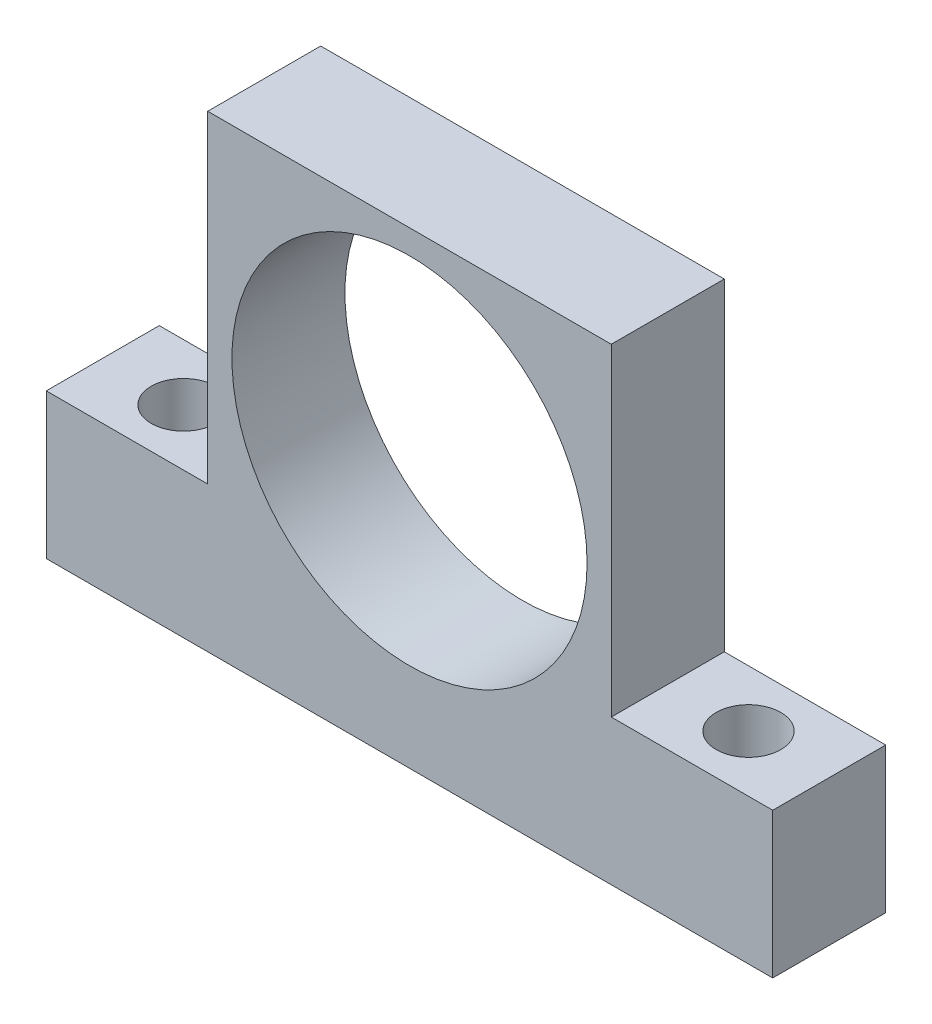
ISO-10303-21;
HEADER;
FILE_DESCRIPTION(('STEP AP214'),'2;1');
FILE_NAME('part.step','',(''),(''),'','','');
FILE_SCHEMA(('AUTOMOTIVE_DESIGN { 1 0 10303 214 1 1 1 1 }'));
ENDSEC;
DATA;
#1=APPLICATION_CONTEXT('core data for automotive mechanical design processes');
#2=APPLICATION_PROTOCOL_DEFINITION('international standard','automotive_design',2000,#1);
#3=PRODUCT_CONTEXT('',#1,'mechanical');
#4=PRODUCT('Part','Part','',(#3));
#5=PRODUCT_RELATED_PRODUCT_CATEGORY('part','',(#4));
#6=PRODUCT_DEFINITION_FORMATION('','',#4);
#7=PRODUCT_DEFINITION_CONTEXT('part definition',#1,'design');
#8=PRODUCT_DEFINITION('design','',#6,#7);
#9=PRODUCT_DEFINITION_SHAPE('','',#8);
#10=(LENGTH_UNIT() NAMED_UNIT(*) SI_UNIT(.MILLI.,.METRE.));
#11=(NAMED_UNIT(*) PLANE_ANGLE_UNIT() SI_UNIT($,.RADIAN.));
#12=(NAMED_UNIT(*) SI_UNIT($,.STERADIAN.) SOLID_ANGLE_UNIT());
#13=UNCERTAINTY_MEASURE_WITH_UNIT(LENGTH_MEASURE(1.E-05),#10,'distance_accuracy_value','');
#14=(GEOMETRIC_REPRESENTATION_CONTEXT(3) GLOBAL_UNCERTAINTY_ASSIGNED_CONTEXT((#13)) GLOBAL_UNIT_ASSIGNED_CONTEXT((#10,
#11,#12)) REPRESENTATION_CONTEXT('',''));
#15=CARTESIAN_POINT('',(0.,0.,0.));
#16=DIRECTION('',(0.,0.,1.));
#17=DIRECTION('',(1.,0.,0.));
#18=AXIS2_PLACEMENT_3D('',#15,#16,#17);
#19=CARTESIAN_POINT('',(12.5,0.,-7.));
#20=DIRECTION('',(1.,0.,0.));
#21=DIRECTION('',(0.,1.,0.));
#22=AXIS2_PLACEMENT_3D('',#19,#20,#21);
#23=PLANE('',#22);
#24=DIRECTION('',(0.,-1.,0.));
#25=VECTOR('',#24,1.);
#26=CARTESIAN_POINT('',(12.5,0.,0.));
#27=LINE('',#26,#25);
#28=CARTESIAN_POINT('',(12.5,12.5,0.));
#29=VERTEX_POINT('',#28);
#30=CARTESIAN_POINT('',(12.5,-7.5,0.));
#31=VERTEX_POINT('',#30);
#32=EDGE_CURVE('E139',#29,#31,#27,.T.);
#33=ORIENTED_EDGE('',*,*,#32,.T.);
#34=DIRECTION('',(0.,0.,1.));
#35=VECTOR('',#34,1.);
#36=CARTESIAN_POINT('',(12.5,-7.5,-7.));
#37=LINE('',#36,#35);
#38=CARTESIAN_POINT('',(12.5,-7.5,-7.));
#39=VERTEX_POINT('',#38);
#40=EDGE_CURVE('E135',#39,#31,#37,.T.);
#41=ORIENTED_EDGE('',*,*,#40,.F.);
#42=DIRECTION('',(0.,-1.,0.));
#43=VECTOR('',#42,1.);
#44=CARTESIAN_POINT('',(12.5,0.,-7.));
#45=LINE('',#44,#43);
#46=CARTESIAN_POINT('',(12.5,12.5,-7.));
#47=VERTEX_POINT('',#46);
#48=EDGE_CURVE('E177',#47,#39,#45,.T.);
#49=ORIENTED_EDGE('',*,*,#48,.F.);
#50=DIRECTION('',(0.,0.,1.));
#51=VECTOR('',#50,1.);
#52=CARTESIAN_POINT('',(12.5,12.5,-7.));
#53=LINE('',#52,#51);
#54=EDGE_CURVE('E11',#47,#29,#53,.T.);
#55=ORIENTED_EDGE('',*,*,#54,.T.);
#56=EDGE_LOOP('',(#33,#41,#49,#55));
#57=FACE_BOUND('',#56,.T.);
#58=ADVANCED_FACE('F39',(#57),#23,.T.);
#59=CARTESIAN_POINT('',(0.,12.5,-7.));
#60=DIRECTION('',(0.,1.,0.));
#61=DIRECTION('',(-1.,0.,0.));
#62=AXIS2_PLACEMENT_3D('',#59,#60,#61);
#63=PLANE('',#62);
#64=DIRECTION('',(1.,0.,0.));
#65=VECTOR('',#64,1.);
#66=CARTESIAN_POINT('',(0.,12.5,0.));
#67=LINE('',#66,#65);
#68=CARTESIAN_POINT('',(-12.5,12.5,0.));
#69=VERTEX_POINT('',#68);
#70=EDGE_CURVE('E143',#69,#29,#67,.T.);
#71=ORIENTED_EDGE('',*,*,#70,.T.);
#72=ORIENTED_EDGE('',*,*,#54,.F.);
#73=DIRECTION('',(1.,0.,0.));
#74=VECTOR('',#73,1.);
#75=CARTESIAN_POINT('',(0.,12.5,-7.));
#76=LINE('',#75,#74);
#77=CARTESIAN_POINT('',(-12.5,12.5,-7.));
#78=VERTEX_POINT('',#77);
#79=EDGE_CURVE('E94',#78,#47,#76,.T.);
#80=ORIENTED_EDGE('',*,*,#79,.F.);
#81=DIRECTION('',(0.,0.,1.));
#82=VECTOR('',#81,1.);
#83=CARTESIAN_POINT('',(-12.5,12.5,-7.));
#84=LINE('',#83,#82);
#85=EDGE_CURVE('E48',#78,#69,#84,.T.);
#86=ORIENTED_EDGE('',*,*,#85,.T.);
#87=EDGE_LOOP('',(#71,#72,#80,#86));
#88=FACE_BOUND('',#87,.T.);
#89=ADVANCED_FACE('F170',(#88),#63,.T.);
#90=CARTESIAN_POINT('',(-12.5,0.,-7.));
#91=DIRECTION('',(1.,0.,0.));
#92=DIRECTION('',(0.,0.,1.));
#93=AXIS2_PLACEMENT_3D('',#90,#91,#92);
#94=PLANE('',#93);
#95=DIRECTION('',(0.,-1.,0.));
#96=VECTOR('',#95,1.);
#97=CARTESIAN_POINT('',(-12.5,0.,0.));
#98=LINE('',#97,#96);
#99=CARTESIAN_POINT('',(-12.5,-7.5,0.));
#100=VERTEX_POINT('',#99);
#101=EDGE_CURVE('E145',#69,#100,#98,.T.);
#102=ORIENTED_EDGE('',*,*,#101,.F.);
#103=ORIENTED_EDGE('',*,*,#85,.F.);
#104=DIRECTION('',(0.,-1.,0.));
#105=VECTOR('',#104,1.);
#106=CARTESIAN_POINT('',(-12.5,0.,-7.));
#107=LINE('',#106,#105);
#108=CARTESIAN_POINT('',(-12.5,-7.5,-7.));
#109=VERTEX_POINT('',#108);
#110=EDGE_CURVE('E179',#78,#109,#107,.T.);
#111=ORIENTED_EDGE('',*,*,#110,.T.);
#112=DIRECTION('',(0.,0.,1.));
#113=VECTOR('',#112,1.);
#114=CARTESIAN_POINT('',(-12.5,-7.5,-7.));
#115=LINE('',#114,#113);
#116=EDGE_CURVE('E164',#109,#100,#115,.T.);
#117=ORIENTED_EDGE('',*,*,#116,.T.);
#118=EDGE_LOOP('',(#102,#103,#111,#117));
#119=FACE_BOUND('',#118,.T.);
#120=ADVANCED_FACE('F193',(#119),#94,.F.);
#121=CARTESIAN_POINT('',(0.,-7.5,-7.));
#122=DIRECTION('',(0.,-1.,0.));
#123=DIRECTION('',(1.,0.,0.));
#124=AXIS2_PLACEMENT_3D('',#121,#122,#123);
#125=PLANE('',#124);
#126=CARTESIAN_POINT('',(-17.5,-7.5,-3.5));
#127=DIRECTION('',(0.,-1.,0.));
#128=DIRECTION('',(-1.,0.,0.));
#129=AXIS2_PLACEMENT_3D('',#126,#127,#128);
#130=CIRCLE('',#129,2.);
#131=CARTESIAN_POINT('',(-19.5,-7.5,-3.5));
#132=VERTEX_POINT('',#131);
#133=EDGE_CURVE('E342',#132,#132,#130,.T.);
#134=ORIENTED_EDGE('',*,*,#133,.T.);
#135=EDGE_LOOP('',(#134));
#136=FACE_BOUND('',#135,.T.);
#137=DIRECTION('',(-1.,0.,0.));
#138=VECTOR('',#137,1.);
#139=CARTESIAN_POINT('',(0.,-7.5,0.));
#140=LINE('',#139,#138);
#141=CARTESIAN_POINT('',(-22.5,-7.5,0.));
#142=VERTEX_POINT('',#141);
#143=EDGE_CURVE('E148',#100,#142,#140,.T.);
#144=ORIENTED_EDGE('',*,*,#143,.F.);
#145=ORIENTED_EDGE('',*,*,#116,.F.);
#146=DIRECTION('',(-1.,0.,0.));
#147=VECTOR('',#146,1.);
#148=CARTESIAN_POINT('',(0.,-7.5,-7.));
#149=LINE('',#148,#147);
#150=CARTESIAN_POINT('',(-22.5,-7.5,-7.));
#151=VERTEX_POINT('',#150);
#152=EDGE_CURVE('E130',#109,#151,#149,.T.);
#153=ORIENTED_EDGE('',*,*,#152,.T.);
#154=DIRECTION('',(0.,0.,1.));
#155=VECTOR('',#154,1.);
#156=CARTESIAN_POINT('',(-22.5,-7.5,-7.));
#157=LINE('',#156,#155);
#158=EDGE_CURVE('E161',#151,#142,#157,.T.);
#159=ORIENTED_EDGE('',*,*,#158,.T.);
#160=EDGE_LOOP('',(#144,#145,#153,#159));
#161=FACE_BOUND('',#160,.T.);
#162=ADVANCED_FACE('F188',(#136,#161),#125,.F.);
#163=CARTESIAN_POINT('',(-22.5,0.,-7.));
#164=DIRECTION('',(-1.,0.,0.));
#165=DIRECTION('',(0.,-1.,0.));
#166=AXIS2_PLACEMENT_3D('',#163,#164,#165);
#167=PLANE('',#166);
#168=DIRECTION('',(0.,1.,0.));
#169=VECTOR('',#168,1.);
#170=CARTESIAN_POINT('',(-22.5,0.,0.));
#171=LINE('',#170,#169);
#172=CARTESIAN_POINT('',(-22.5,-16.5,0.));
#173=VERTEX_POINT('',#172);
#174=EDGE_CURVE('E151',#173,#142,#171,.T.);
#175=ORIENTED_EDGE('',*,*,#174,.T.);
#176=ORIENTED_EDGE('',*,*,#158,.F.);
#177=DIRECTION('',(0.,1.,0.));
#178=VECTOR('',#177,1.);
#179=CARTESIAN_POINT('',(-22.5,0.,-7.));
#180=LINE('',#179,#178);
#181=CARTESIAN_POINT('',(-22.5,-16.5,-7.));
#182=VERTEX_POINT('',#181);
#183=EDGE_CURVE('E128',#182,#151,#180,.T.);
#184=ORIENTED_EDGE('',*,*,#183,.F.);
#185=DIRECTION('',(0.,0.,1.));
#186=VECTOR('',#185,1.);
#187=CARTESIAN_POINT('',(-22.5,-16.5,-7.));
#188=LINE('',#187,#186);
#189=EDGE_CURVE('E122',#182,#173,#188,.T.);
#190=ORIENTED_EDGE('',*,*,#189,.T.);
#191=EDGE_LOOP('',(#175,#176,#184,#190));
#192=FACE_BOUND('',#191,.T.);
#193=ADVANCED_FACE('F191',(#192),#167,.T.);
#194=CARTESIAN_POINT('',(0.,-16.5,-7.));
#195=DIRECTION('',(0.,1.,0.));
#196=DIRECTION('',(0.,0.,-1.));
#197=AXIS2_PLACEMENT_3D('',#194,#195,#196);
#198=PLANE('',#197);
#199=DIRECTION('',(1.,0.,0.));
#200=VECTOR('',#199,1.);
#201=CARTESIAN_POINT('',(0.,-16.5,0.));
#202=LINE('',#201,#200);
#203=CARTESIAN_POINT('',(22.5,-16.5,0.));
#204=VERTEX_POINT('',#203);
#205=EDGE_CURVE('E153',#173,#204,#202,.T.);
#206=ORIENTED_EDGE('',*,*,#205,.F.);
#207=ORIENTED_EDGE('',*,*,#189,.F.);
#208=DIRECTION('',(1.,0.,0.));
#209=VECTOR('',#208,1.);
#210=CARTESIAN_POINT('',(0.,-16.5,-7.));
#211=LINE('',#210,#209);
#212=CARTESIAN_POINT('',(22.5,-16.5,-7.));
#213=VERTEX_POINT('',#212);
#214=EDGE_CURVE('E112',#182,#213,#211,.T.);
#215=ORIENTED_EDGE('',*,*,#214,.T.);
#216=DIRECTION('',(0.,0.,1.));
#217=VECTOR('',#216,1.);
#218=CARTESIAN_POINT('',(22.5,-16.5,-7.));
#219=LINE('',#218,#217);
#220=EDGE_CURVE('E117',#213,#204,#219,.T.);
#221=ORIENTED_EDGE('',*,*,#220,.T.);
#222=EDGE_LOOP('',(#206,#207,#215,#221));
#223=FACE_BOUND('',#222,.T.);
#224=ADVANCED_FACE('F125',(#223),#198,.F.);
#225=CARTESIAN_POINT('',(22.5,0.,-7.));
#226=DIRECTION('',(-1.,0.,0.));
#227=DIRECTION('',(0.,-1.,0.));
#228=AXIS2_PLACEMENT_3D('',#225,#226,#227);
#229=PLANE('',#228);
#230=DIRECTION('',(0.,1.,0.));
#231=VECTOR('',#230,1.);
#232=CARTESIAN_POINT('',(22.5,0.,0.));
#233=LINE('',#232,#231);
#234=CARTESIAN_POINT('',(22.5,-7.5,0.));
#235=VERTEX_POINT('',#234);
#236=EDGE_CURVE('E119',#204,#235,#233,.T.);
#237=ORIENTED_EDGE('',*,*,#236,.F.);
#238=ORIENTED_EDGE('',*,*,#220,.F.);
#239=DIRECTION('',(0.,1.,0.));
#240=VECTOR('',#239,1.);
#241=CARTESIAN_POINT('',(22.5,0.,-7.));
#242=LINE('',#241,#240);
#243=CARTESIAN_POINT('',(22.5,-7.5,-7.));
#244=VERTEX_POINT('',#243);
#245=EDGE_CURVE('E108',#213,#244,#242,.T.);
#246=ORIENTED_EDGE('',*,*,#245,.T.);
#247=DIRECTION('',(0.,0.,1.));
#248=VECTOR('',#247,1.);
#249=CARTESIAN_POINT('',(22.5,-7.5,-7.));
#250=LINE('',#249,#248);
#251=EDGE_CURVE('E123',#244,#235,#250,.T.);
#252=ORIENTED_EDGE('',*,*,#251,.T.);
#253=EDGE_LOOP('',(#237,#238,#246,#252));
#254=FACE_BOUND('',#253,.T.);
#255=ADVANCED_FACE('F118',(#254),#229,.F.);
#256=CARTESIAN_POINT('',(0.,0.,-7.));
#257=DIRECTION('',(0.,0.,1.));
#258=DIRECTION('',(-1.,0.,0.));
#259=AXIS2_PLACEMENT_3D('',#256,#257,#258);
#260=CYLINDRICAL_SURFACE('',#259,11.);
#261=CARTESIAN_POINT('',(0.,0.,-7.));
#262=DIRECTION('',(0.,0.,1.));
#263=DIRECTION('',(1.,0.,0.));
#264=AXIS2_PLACEMENT_3D('',#261,#262,#263);
#265=CIRCLE('',#264,11.);
#266=CARTESIAN_POINT('',(11.,0.,-7.));
#267=VERTEX_POINT('',#266);
#268=EDGE_CURVE('E157',#267,#267,#265,.T.);
#269=ORIENTED_EDGE('',*,*,#268,.F.);
#270=EDGE_LOOP('',(#269));
#271=FACE_BOUND('',#270,.T.);
#272=CARTESIAN_POINT('',(0.,0.,0.));
#273=DIRECTION('',(0.,0.,1.));
#274=DIRECTION('',(1.,0.,0.));
#275=AXIS2_PLACEMENT_3D('',#272,#273,#274);
#276=CIRCLE('',#275,11.);
#277=CARTESIAN_POINT('',(11.,0.,0.));
#278=VERTEX_POINT('',#277);
#279=EDGE_CURVE('E136',#278,#278,#276,.T.);
#280=ORIENTED_EDGE('',*,*,#279,.T.);
#281=EDGE_LOOP('',(#280));
#282=FACE_BOUND('',#281,.T.);
#283=ADVANCED_FACE('F41',(#271,#282),#260,.F.);
#284=CARTESIAN_POINT('',(0.,-7.5,-7.));
#285=DIRECTION('',(0.,1.,0.));
#286=DIRECTION('',(0.,0.,-1.));
#287=AXIS2_PLACEMENT_3D('',#284,#285,#286);
#288=PLANE('',#287);
#289=CARTESIAN_POINT('',(17.5,-7.49999999999999,-3.5));
#290=DIRECTION('',(0.,-1.,0.));
#291=DIRECTION('',(-1.,0.,0.));
#292=AXIS2_PLACEMENT_3D('',#289,#290,#291);
#293=CIRCLE('',#292,2.);
#294=CARTESIAN_POINT('',(15.5,-7.49999999999999,-3.5));
#295=VERTEX_POINT('',#294);
#296=EDGE_CURVE('E345',#295,#295,#293,.T.);
#297=ORIENTED_EDGE('',*,*,#296,.T.);
#298=EDGE_LOOP('',(#297));
#299=FACE_BOUND('',#298,.T.);
#300=DIRECTION('',(1.,0.,0.));
#301=VECTOR('',#300,1.);
#302=CARTESIAN_POINT('',(0.,-7.5,0.));
#303=LINE('',#302,#301);
#304=EDGE_CURVE('E82',#31,#235,#303,.T.);
#305=ORIENTED_EDGE('',*,*,#304,.T.);
#306=ORIENTED_EDGE('',*,*,#251,.F.);
#307=DIRECTION('',(1.,0.,0.));
#308=VECTOR('',#307,1.);
#309=CARTESIAN_POINT('',(0.,-7.5,-7.));
#310=LINE('',#309,#308);
#311=EDGE_CURVE('E56',#39,#244,#310,.T.);
#312=ORIENTED_EDGE('',*,*,#311,.F.);
#313=ORIENTED_EDGE('',*,*,#40,.T.);
#314=EDGE_LOOP('',(#305,#306,#312,#313));
#315=FACE_BOUND('',#314,.T.);
#316=ADVANCED_FACE('F256',(#299,#315),#288,.T.);
#317=CARTESIAN_POINT('',(0.,0.,-7.));
#318=DIRECTION('',(0.,0.,-1.));
#319=DIRECTION('',(1.,0.,0.));
#320=AXIS2_PLACEMENT_3D('',#317,#318,#319);
#321=PLANE('',#320);
#322=ORIENTED_EDGE('',*,*,#268,.T.);
#323=EDGE_LOOP('',(#322));
#324=FACE_BOUND('',#323,.T.);
#325=ORIENTED_EDGE('',*,*,#48,.T.);
#326=ORIENTED_EDGE('',*,*,#311,.T.);
#327=ORIENTED_EDGE('',*,*,#245,.F.);
#328=ORIENTED_EDGE('',*,*,#214,.F.);
#329=ORIENTED_EDGE('',*,*,#183,.T.);
#330=ORIENTED_EDGE('',*,*,#152,.F.);
#331=ORIENTED_EDGE('',*,*,#110,.F.);
#332=ORIENTED_EDGE('',*,*,#79,.T.);
#333=EDGE_LOOP('',(#325,#326,#327,#328,#329,#330,#331,#332));
#334=FACE_BOUND('',#333,.T.);
#335=ADVANCED_FACE('F110',(#324,#334),#321,.T.);
#336=CARTESIAN_POINT('',(0.,0.,0.));
#337=DIRECTION('',(0.,0.,-1.));
#338=DIRECTION('',(1.,0.,0.));
#339=AXIS2_PLACEMENT_3D('',#336,#337,#338);
#340=PLANE('',#339);
#341=ORIENTED_EDGE('',*,*,#279,.F.);
#342=EDGE_LOOP('',(#341));
#343=FACE_BOUND('',#342,.T.);
#344=ORIENTED_EDGE('',*,*,#32,.F.);
#345=ORIENTED_EDGE('',*,*,#70,.F.);
#346=ORIENTED_EDGE('',*,*,#101,.T.);
#347=ORIENTED_EDGE('',*,*,#143,.T.);
#348=ORIENTED_EDGE('',*,*,#174,.F.);
#349=ORIENTED_EDGE('',*,*,#205,.T.);
#350=ORIENTED_EDGE('',*,*,#236,.T.);
#351=ORIENTED_EDGE('',*,*,#304,.F.);
#352=EDGE_LOOP('',(#344,#345,#346,#347,#348,#349,#350,#351));
#353=FACE_BOUND('',#352,.T.);
#354=ADVANCED_FACE('F173',(#343,#353),#340,.F.);
#355=CARTESIAN_POINT('',(17.5,-14.5,-3.5));
#356=DIRECTION('',(0.,1.,0.));
#357=DIRECTION('',(-1.,0.,0.));
#358=AXIS2_PLACEMENT_3D('',#355,#356,#357);
#359=CYLINDRICAL_SURFACE('',#358,2.);
#360=CARTESIAN_POINT('',(17.5,-14.5,-3.5));
#361=DIRECTION('',(0.,-1.,0.));
#362=DIRECTION('',(-1.,0.,0.));
#363=AXIS2_PLACEMENT_3D('',#360,#361,#362);
#364=CIRCLE('',#363,2.);
#365=CARTESIAN_POINT('',(15.5,-14.5,-3.5));
#366=VERTEX_POINT('',#365);
#367=EDGE_CURVE('E349',#366,#366,#364,.T.);
#368=ORIENTED_EDGE('',*,*,#367,.T.);
#369=EDGE_LOOP('',(#368));
#370=FACE_BOUND('',#369,.T.);
#371=ORIENTED_EDGE('',*,*,#296,.F.);
#372=EDGE_LOOP('',(#371));
#373=FACE_BOUND('',#372,.T.);
#374=ADVANCED_FACE('F286',(#370,#373),#359,.F.);
#375=CARTESIAN_POINT('',(17.5,-14.5,-3.5));
#376=DIRECTION('',(0.,1.,0.));
#377=DIRECTION('',(-1.,0.,0.));
#378=AXIS2_PLACEMENT_3D('',#375,#376,#377);
#379=PLANE('',#378);
#380=ORIENTED_EDGE('',*,*,#367,.F.);
#381=EDGE_LOOP('',(#380));
#382=FACE_BOUND('',#381,.T.);
#383=ADVANCED_FACE('F297',(#382),#379,.T.);
#384=CARTESIAN_POINT('',(-17.5,-14.5,-3.5));
#385=DIRECTION('',(0.,1.,0.));
#386=DIRECTION('',(-1.,0.,0.));
#387=AXIS2_PLACEMENT_3D('',#384,#385,#386);
#388=CYLINDRICAL_SURFACE('',#387,2.);
#389=CARTESIAN_POINT('',(-17.5,-14.5,-3.5));
#390=DIRECTION('',(0.,-1.,0.));
#391=DIRECTION('',(-1.,0.,0.));
#392=AXIS2_PLACEMENT_3D('',#389,#390,#391);
#393=CIRCLE('',#392,2.);
#394=CARTESIAN_POINT('',(-19.5,-14.5,-3.5));
#395=VERTEX_POINT('',#394);
#396=EDGE_CURVE('E140',#395,#395,#393,.T.);
#397=ORIENTED_EDGE('',*,*,#396,.T.);
#398=EDGE_LOOP('',(#397));
#399=FACE_BOUND('',#398,.T.);
#400=ORIENTED_EDGE('',*,*,#133,.F.);
#401=EDGE_LOOP('',(#400));
#402=FACE_BOUND('',#401,.T.);
#403=ADVANCED_FACE('F307',(#399,#402),#388,.F.);
#404=CARTESIAN_POINT('',(0.,-14.5,0.));
#405=DIRECTION('',(0.,1.,0.));
#406=DIRECTION('',(-1.,0.,0.));
#407=AXIS2_PLACEMENT_3D('',#404,#405,#406);
#408=PLANE('',#407);
#409=ORIENTED_EDGE('',*,*,#396,.F.);
#410=EDGE_LOOP('',(#409));
#411=FACE_BOUND('',#410,.T.);
#412=ADVANCED_FACE('F317',(#411),#408,.T.);
#413=CLOSED_SHELL('',(#58,#89,#120,#162,#193,#224,#255,#283,#316,#335,#354,#374,#383,#403,#412));
#414=MANIFOLD_SOLID_BREP('B2',#413);
#415=ADVANCED_BREP_SHAPE_REPRESENTATION('',(#18,#414),#14);
#416=SHAPE_DEFINITION_REPRESENTATION(#9,#415);
ENDSEC;
END-ISO-10303-21;
